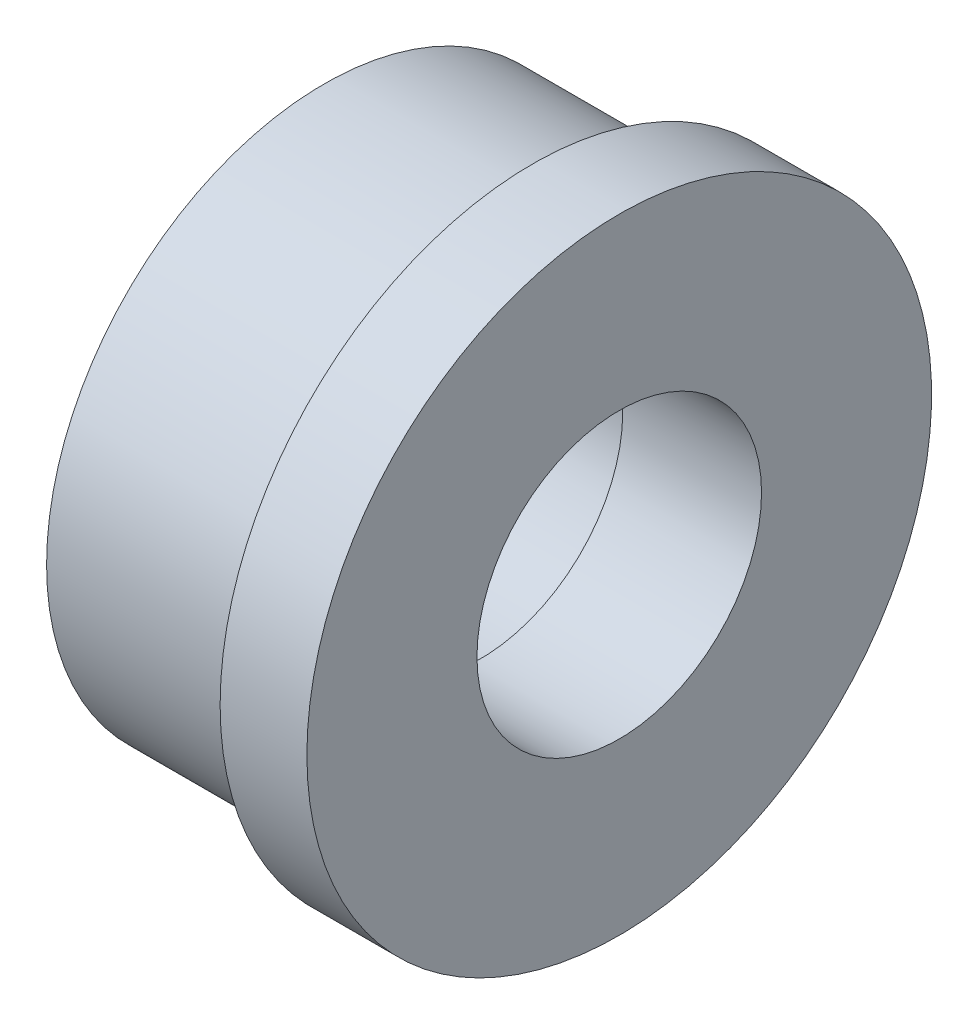
ISO-10303-21;
HEADER;
FILE_DESCRIPTION(('STEP AP214'),'2;1');
FILE_NAME('part.step','',(''),(''),'','','');
FILE_SCHEMA(('AUTOMOTIVE_DESIGN { 1 0 10303 214 1 1 1 1 }'));
ENDSEC;
DATA;
#1=APPLICATION_CONTEXT('core data for automotive mechanical design processes');
#2=APPLICATION_PROTOCOL_DEFINITION('international standard','automotive_design',2000,#1);
#3=PRODUCT_CONTEXT('',#1,'mechanical');
#4=PRODUCT('Part','Part','',(#3));
#5=PRODUCT_RELATED_PRODUCT_CATEGORY('part','',(#4));
#6=PRODUCT_DEFINITION_FORMATION('','',#4);
#7=PRODUCT_DEFINITION_CONTEXT('part definition',#1,'design');
#8=PRODUCT_DEFINITION('design','',#6,#7);
#9=PRODUCT_DEFINITION_SHAPE('','',#8);
#10=(LENGTH_UNIT() NAMED_UNIT(*) SI_UNIT(.MILLI.,.METRE.));
#11=(NAMED_UNIT(*) PLANE_ANGLE_UNIT() SI_UNIT($,.RADIAN.));
#12=(NAMED_UNIT(*) SI_UNIT($,.STERADIAN.) SOLID_ANGLE_UNIT());
#13=UNCERTAINTY_MEASURE_WITH_UNIT(LENGTH_MEASURE(1.E-05),#10,'distance_accuracy_value','');
#14=(GEOMETRIC_REPRESENTATION_CONTEXT(3) GLOBAL_UNCERTAINTY_ASSIGNED_CONTEXT((#13)) GLOBAL_UNIT_ASSIGNED_CONTEXT((#10,
#11,#12)) REPRESENTATION_CONTEXT('',''));
#15=CARTESIAN_POINT('',(0.,0.,0.));
#16=DIRECTION('',(0.,0.,1.));
#17=DIRECTION('',(1.,0.,0.));
#18=AXIS2_PLACEMENT_3D('',#15,#16,#17);
#19=CARTESIAN_POINT('',(-4.25,9.,0.));
#20=DIRECTION('',(1.,0.,0.));
#21=DIRECTION('',(0.,0.,-1.));
#22=AXIS2_PLACEMENT_3D('',#19,#20,#21);
#23=PLANE('',#22);
#24=CARTESIAN_POINT('',(-4.25,0.,0.));
#25=DIRECTION('',(-1.,0.,0.));
#26=DIRECTION('',(0.,0.,1.));
#27=AXIS2_PLACEMENT_3D('',#24,#25,#26);
#28=CIRCLE('',#27,4.15);
#29=CARTESIAN_POINT('',(-4.25,0.,4.15));
#30=VERTEX_POINT('',#29);
#31=EDGE_CURVE('E55',#30,#30,#28,.T.);
#32=ORIENTED_EDGE('',*,*,#31,.F.);
#33=EDGE_LOOP('',(#32));
#34=FACE_BOUND('',#33,.T.);
#35=CARTESIAN_POINT('',(-4.25,0.,0.));
#36=DIRECTION('',(-1.,0.,0.));
#37=DIRECTION('',(0.,0.,1.));
#38=AXIS2_PLACEMENT_3D('',#35,#36,#37);
#39=CIRCLE('',#38,8.);
#40=CARTESIAN_POINT('',(-4.25,0.,8.));
#41=VERTEX_POINT('',#40);
#42=EDGE_CURVE('E73',#41,#41,#39,.T.);
#43=ORIENTED_EDGE('',*,*,#42,.T.);
#44=EDGE_LOOP('',(#43));
#45=FACE_BOUND('',#44,.T.);
#46=ADVANCED_FACE('F37',(#34,#45),#23,.F.);
#47=CARTESIAN_POINT('',(0.,0.,0.));
#48=DIRECTION('',(-1.,0.,0.));
#49=DIRECTION('',(0.,0.,1.));
#50=AXIS2_PLACEMENT_3D('',#47,#48,#49);
#51=CYLINDRICAL_SURFACE('',#50,9.);
#52=CARTESIAN_POINT('',(4.25,0.,0.));
#53=DIRECTION('',(-1.,0.,0.));
#54=DIRECTION('',(0.,0.,1.));
#55=AXIS2_PLACEMENT_3D('',#52,#53,#54);
#56=CIRCLE('',#55,9.);
#57=CARTESIAN_POINT('',(4.25,0.,9.));
#58=VERTEX_POINT('',#57);
#59=EDGE_CURVE('E61',#58,#58,#56,.T.);
#60=ORIENTED_EDGE('',*,*,#59,.T.);
#61=EDGE_LOOP('',(#60));
#62=FACE_BOUND('',#61,.T.);
#63=CARTESIAN_POINT('',(1.75,0.,0.));
#64=DIRECTION('',(-1.,0.,0.));
#65=DIRECTION('',(0.,0.,1.));
#66=AXIS2_PLACEMENT_3D('',#63,#64,#65);
#67=CIRCLE('',#66,9.);
#68=CARTESIAN_POINT('',(1.75,0.,9.));
#69=VERTEX_POINT('',#68);
#70=EDGE_CURVE('E65',#69,#69,#67,.T.);
#71=ORIENTED_EDGE('',*,*,#70,.F.);
#72=EDGE_LOOP('',(#71));
#73=FACE_BOUND('',#72,.T.);
#74=ADVANCED_FACE('F91',(#62,#73),#51,.T.);
#75=CARTESIAN_POINT('',(4.25,4.1,0.));
#76=DIRECTION('',(-1.,0.,0.));
#77=DIRECTION('',(0.,0.,1.));
#78=AXIS2_PLACEMENT_3D('',#75,#76,#77);
#79=PLANE('',#78);
#80=ORIENTED_EDGE('',*,*,#59,.F.);
#81=EDGE_LOOP('',(#80));
#82=FACE_BOUND('',#81,.T.);
#83=CARTESIAN_POINT('',(4.25,0.,0.));
#84=DIRECTION('',(-1.,0.,0.));
#85=DIRECTION('',(0.,0.,1.));
#86=AXIS2_PLACEMENT_3D('',#83,#84,#85);
#87=CIRCLE('',#86,4.1);
#88=CARTESIAN_POINT('',(4.25,0.,4.1));
#89=VERTEX_POINT('',#88);
#90=EDGE_CURVE('E10',#89,#89,#87,.T.);
#91=ORIENTED_EDGE('',*,*,#90,.T.);
#92=EDGE_LOOP('',(#91));
#93=FACE_BOUND('',#92,.T.);
#94=ADVANCED_FACE('F39',(#82,#93),#79,.F.);
#95=CARTESIAN_POINT('',(0.,0.,0.));
#96=DIRECTION('',(-1.,0.,0.));
#97=DIRECTION('',(0.,0.,1.));
#98=AXIS2_PLACEMENT_3D('',#95,#96,#97);
#99=CYLINDRICAL_SURFACE('',#98,4.1);
#100=ORIENTED_EDGE('',*,*,#90,.F.);
#101=EDGE_LOOP('',(#100));
#102=FACE_BOUND('',#101,.T.);
#103=CARTESIAN_POINT('',(0.25,0.,0.));
#104=DIRECTION('',(-1.,0.,0.));
#105=DIRECTION('',(0.,0.,1.));
#106=AXIS2_PLACEMENT_3D('',#103,#104,#105);
#107=CIRCLE('',#106,4.1);
#108=CARTESIAN_POINT('',(0.25,0.,4.1));
#109=VERTEX_POINT('',#108);
#110=EDGE_CURVE('E45',#109,#109,#107,.T.);
#111=ORIENTED_EDGE('',*,*,#110,.T.);
#112=EDGE_LOOP('',(#111));
#113=FACE_BOUND('',#112,.T.);
#114=ADVANCED_FACE('F106',(#102,#113),#99,.F.);
#115=CARTESIAN_POINT('',(0.25,4.15,0.));
#116=DIRECTION('',(1.,0.,0.));
#117=DIRECTION('',(0.,0.,-1.));
#118=AXIS2_PLACEMENT_3D('',#115,#116,#117);
#119=PLANE('',#118);
#120=ORIENTED_EDGE('',*,*,#110,.F.);
#121=EDGE_LOOP('',(#120));
#122=FACE_BOUND('',#121,.T.);
#123=CARTESIAN_POINT('',(0.25,0.,0.));
#124=DIRECTION('',(-1.,0.,0.));
#125=DIRECTION('',(0.,0.,1.));
#126=AXIS2_PLACEMENT_3D('',#123,#124,#125);
#127=CIRCLE('',#126,4.15);
#128=CARTESIAN_POINT('',(0.25,0.,4.15));
#129=VERTEX_POINT('',#128);
#130=EDGE_CURVE('E50',#129,#129,#127,.T.);
#131=ORIENTED_EDGE('',*,*,#130,.T.);
#132=EDGE_LOOP('',(#131));
#133=FACE_BOUND('',#132,.T.);
#134=ADVANCED_FACE('F103',(#122,#133),#119,.F.);
#135=CARTESIAN_POINT('',(0.,0.,0.));
#136=DIRECTION('',(-1.,0.,0.));
#137=DIRECTION('',(0.,0.,1.));
#138=AXIS2_PLACEMENT_3D('',#135,#136,#137);
#139=CYLINDRICAL_SURFACE('',#138,4.15);
#140=ORIENTED_EDGE('',*,*,#130,.F.);
#141=EDGE_LOOP('',(#140));
#142=FACE_BOUND('',#141,.T.);
#143=ORIENTED_EDGE('',*,*,#31,.T.);
#144=EDGE_LOOP('',(#143));
#145=FACE_BOUND('',#144,.T.);
#146=ADVANCED_FACE('F87',(#142,#145),#139,.F.);
#147=CARTESIAN_POINT('',(1.75,8.,0.));
#148=DIRECTION('',(-1.,0.,0.));
#149=DIRECTION('',(0.,0.,1.));
#150=AXIS2_PLACEMENT_3D('',#147,#148,#149);
#151=PLANE('',#150);
#152=ORIENTED_EDGE('',*,*,#70,.T.);
#153=EDGE_LOOP('',(#152));
#154=FACE_BOUND('',#153,.T.);
#155=CARTESIAN_POINT('',(1.75,0.,0.));
#156=DIRECTION('',(-1.,0.,0.));
#157=DIRECTION('',(0.,0.,1.));
#158=AXIS2_PLACEMENT_3D('',#155,#156,#157);
#159=CIRCLE('',#158,8.);
#160=CARTESIAN_POINT('',(1.75,0.,8.));
#161=VERTEX_POINT('',#160);
#162=EDGE_CURVE('E69',#161,#161,#159,.T.);
#163=ORIENTED_EDGE('',*,*,#162,.F.);
#164=EDGE_LOOP('',(#163));
#165=FACE_BOUND('',#164,.T.);
#166=ADVANCED_FACE('F81',(#154,#165),#151,.T.);
#167=CARTESIAN_POINT('',(0.,0.,0.));
#168=DIRECTION('',(-1.,0.,0.));
#169=DIRECTION('',(0.,0.,1.));
#170=AXIS2_PLACEMENT_3D('',#167,#168,#169);
#171=CYLINDRICAL_SURFACE('',#170,8.);
#172=ORIENTED_EDGE('',*,*,#162,.T.);
#173=EDGE_LOOP('',(#172));
#174=FACE_BOUND('',#173,.T.);
#175=ORIENTED_EDGE('',*,*,#42,.F.);
#176=EDGE_LOOP('',(#175));
#177=FACE_BOUND('',#176,.T.);
#178=ADVANCED_FACE('F79',(#174,#177),#171,.T.);
#179=CLOSED_SHELL('',(#46,#74,#94,#114,#134,#146,#166,#178));
#180=MANIFOLD_SOLID_BREP('B2',#179);
#181=ADVANCED_BREP_SHAPE_REPRESENTATION('',(#18,#180),#14);
#182=SHAPE_DEFINITION_REPRESENTATION(#9,#181);
ENDSEC;
END-ISO-10303-21;
